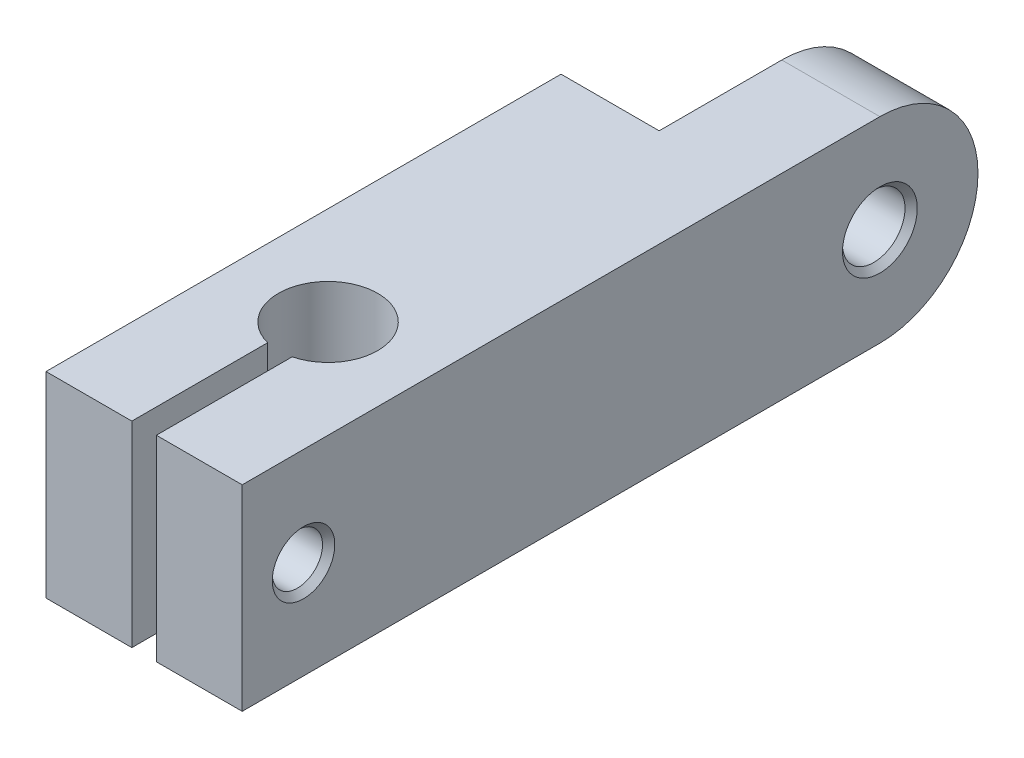
ISO-10303-21;
HEADER;
FILE_DESCRIPTION(('STEP AP214'),'2;1');
FILE_NAME('part.step','',(''),(''),'','','');
FILE_SCHEMA(('AUTOMOTIVE_DESIGN { 1 0 10303 214 1 1 1 1 }'));
ENDSEC;
DATA;
#1=APPLICATION_CONTEXT('core data for automotive mechanical design processes');
#2=APPLICATION_PROTOCOL_DEFINITION('international standard','automotive_design',2000,#1);
#3=PRODUCT_CONTEXT('',#1,'mechanical');
#4=PRODUCT('Part','Part','',(#3));
#5=PRODUCT_RELATED_PRODUCT_CATEGORY('part','',(#4));
#6=PRODUCT_DEFINITION_FORMATION('','',#4);
#7=PRODUCT_DEFINITION_CONTEXT('part definition',#1,'design');
#8=PRODUCT_DEFINITION('design','',#6,#7);
#9=PRODUCT_DEFINITION_SHAPE('','',#8);
#10=(LENGTH_UNIT() NAMED_UNIT(*) SI_UNIT(.MILLI.,.METRE.));
#11=(NAMED_UNIT(*) PLANE_ANGLE_UNIT() SI_UNIT($,.RADIAN.));
#12=(NAMED_UNIT(*) SI_UNIT($,.STERADIAN.) SOLID_ANGLE_UNIT());
#13=UNCERTAINTY_MEASURE_WITH_UNIT(LENGTH_MEASURE(1.E-05),#10,'distance_accuracy_value','');
#14=(GEOMETRIC_REPRESENTATION_CONTEXT(3) GLOBAL_UNCERTAINTY_ASSIGNED_CONTEXT((#13)) GLOBAL_UNIT_ASSIGNED_CONTEXT((#10,
#11,#12)) REPRESENTATION_CONTEXT('',''));
#15=CARTESIAN_POINT('',(0.,0.,0.));
#16=DIRECTION('',(0.,0.,1.));
#17=DIRECTION('',(1.,0.,0.));
#18=AXIS2_PLACEMENT_3D('',#15,#16,#17);
#19=CARTESIAN_POINT('',(8.,8.,60.));
#20=DIRECTION('',(0.,-1.,0.));
#21=DIRECTION('',(1.,0.,0.));
#22=AXIS2_PLACEMENT_3D('',#19,#20,#21);
#23=PLANE('',#22);
#24=DIRECTION('',(-1.,0.,0.));
#25=VECTOR('',#24,1.);
#26=CARTESIAN_POINT('',(8.,8.,8.));
#27=LINE('',#26,#25);
#28=CARTESIAN_POINT('',(8.,8.,8.));
#29=VERTEX_POINT('',#28);
#30=CARTESIAN_POINT('',(0.,8.,8.));
#31=VERTEX_POINT('',#30);
#32=EDGE_CURVE('E124',#29,#31,#27,.T.);
#33=ORIENTED_EDGE('',*,*,#32,.T.);
#34=DIRECTION('',(0.,0.,-1.));
#35=VECTOR('',#34,1.);
#36=CARTESIAN_POINT('',(0.,8.,0.));
#37=LINE('',#36,#35);
#38=CARTESIAN_POINT('',(0.,8.,18.));
#39=VERTEX_POINT('',#38);
#40=EDGE_CURVE('E267',#39,#31,#37,.T.);
#41=ORIENTED_EDGE('',*,*,#40,.F.);
#42=DIRECTION('',(1.,0.,0.));
#43=VECTOR('',#42,1.);
#44=CARTESIAN_POINT('',(-8.,8.,18.));
#45=LINE('',#44,#43);
#46=CARTESIAN_POINT('',(-8.,8.,18.));
#47=VERTEX_POINT('',#46);
#48=EDGE_CURVE('E265',#47,#39,#45,.T.);
#49=ORIENTED_EDGE('',*,*,#48,.F.);
#50=DIRECTION('',(0.,0.,-1.));
#51=VECTOR('',#50,1.);
#52=CARTESIAN_POINT('',(-8.,8.,60.));
#53=LINE('',#52,#51);
#54=CARTESIAN_POINT('',(-8.,8.,60.));
#55=VERTEX_POINT('',#54);
#56=EDGE_CURVE('E148',#55,#47,#53,.T.);
#57=ORIENTED_EDGE('',*,*,#56,.F.);
#58=DIRECTION('',(-1.,0.,0.));
#59=VECTOR('',#58,1.);
#60=CARTESIAN_POINT('',(8.,8.,60.));
#61=LINE('',#60,#59);
#62=CARTESIAN_POINT('',(-0.999999999999996,8.,60.));
#63=VERTEX_POINT('',#62);
#64=EDGE_CURVE('E62',#63,#55,#61,.T.);
#65=ORIENTED_EDGE('',*,*,#64,.F.);
#66=DIRECTION('',(0.,0.,-1.));
#67=VECTOR('',#66,1.);
#68=CARTESIAN_POINT('',(-1.00000000000001,8.,0.));
#69=LINE('',#68,#67);
#70=CARTESIAN_POINT('',(-0.999999999999996,8.,48.9246018906381));
#71=VERTEX_POINT('',#70);
#72=EDGE_CURVE('E55',#63,#71,#69,.T.);
#73=ORIENTED_EDGE('',*,*,#72,.T.);
#74=CARTESIAN_POINT('',(0.,8.,45.));
#75=DIRECTION('',(0.,1.,0.));
#76=DIRECTION('',(-1.,0.,0.));
#77=AXIS2_PLACEMENT_3D('',#74,#75,#76);
#78=CIRCLE('',#77,4.05);
#79=CARTESIAN_POINT('',(1.00000000000001,8.,48.9246018906381));
#80=VERTEX_POINT('',#79);
#81=EDGE_CURVE('E218',#80,#71,#78,.T.);
#82=ORIENTED_EDGE('',*,*,#81,.F.);
#83=DIRECTION('',(0.,0.,-1.));
#84=VECTOR('',#83,1.);
#85=CARTESIAN_POINT('',(1.00000000000001,8.,0.));
#86=LINE('',#85,#84);
#87=CARTESIAN_POINT('',(1.00000000000001,8.,60.));
#88=VERTEX_POINT('',#87);
#89=EDGE_CURVE('E232',#88,#80,#86,.T.);
#90=ORIENTED_EDGE('',*,*,#89,.F.);
#91=CARTESIAN_POINT('',(8.,8.,60.));
#92=VERTEX_POINT('',#91);
#93=EDGE_CURVE('E255',#92,#88,#61,.T.);
#94=ORIENTED_EDGE('',*,*,#93,.F.);
#95=DIRECTION('',(0.,0.,-1.));
#96=VECTOR('',#95,1.);
#97=CARTESIAN_POINT('',(8.,8.,60.));
#98=LINE('',#97,#96);
#99=EDGE_CURVE('E143',#92,#29,#98,.T.);
#100=ORIENTED_EDGE('',*,*,#99,.T.);
#101=EDGE_LOOP('',(#33,#41,#49,#57,#65,#73,#82,#90,#94,#100));
#102=FACE_BOUND('',#101,.T.);
#103=ADVANCED_FACE('F39',(#102),#23,.F.);
#104=CARTESIAN_POINT('',(0.,0.,60.));
#105=DIRECTION('',(0.,0.,1.));
#106=DIRECTION('',(1.,0.,0.));
#107=AXIS2_PLACEMENT_3D('',#104,#105,#106);
#108=PLANE('',#107);
#109=DIRECTION('',(1.,0.,0.));
#110=VECTOR('',#109,1.);
#111=CARTESIAN_POINT('',(8.,-8.,60.));
#112=LINE('',#111,#110);
#113=CARTESIAN_POINT('',(-8.,-8.,60.));
#114=VERTEX_POINT('',#113);
#115=CARTESIAN_POINT('',(-0.999999999999993,-8.,60.));
#116=VERTEX_POINT('',#115);
#117=EDGE_CURVE('E251',#114,#116,#112,.T.);
#118=ORIENTED_EDGE('',*,*,#117,.T.);
#119=DIRECTION('',(0.,1.,0.));
#120=VECTOR('',#119,1.);
#121=CARTESIAN_POINT('',(-0.999999999999993,-8.,60.));
#122=LINE('',#121,#120);
#123=EDGE_CURVE('E246',#116,#63,#122,.T.);
#124=ORIENTED_EDGE('',*,*,#123,.T.);
#125=ORIENTED_EDGE('',*,*,#64,.T.);
#126=DIRECTION('',(0.,-1.,0.));
#127=VECTOR('',#126,1.);
#128=CARTESIAN_POINT('',(-8.,-8.,60.));
#129=LINE('',#128,#127);
#130=EDGE_CURVE('E243',#55,#114,#129,.T.);
#131=ORIENTED_EDGE('',*,*,#130,.T.);
#132=EDGE_LOOP('',(#118,#124,#125,#131));
#133=FACE_BOUND('',#132,.T.);
#134=ADVANCED_FACE('F174',(#133),#108,.T.);
#135=CARTESIAN_POINT('',(-8.,-8.,60.));
#136=DIRECTION('',(1.,0.,0.));
#137=DIRECTION('',(0.,0.,-1.));
#138=AXIS2_PLACEMENT_3D('',#135,#136,#137);
#139=PLANE('',#138);
#140=CARTESIAN_POINT('',(-8.,0.,55.));
#141=DIRECTION('',(-1.,0.,0.));
#142=DIRECTION('',(0.,0.,1.));
#143=AXIS2_PLACEMENT_3D('',#140,#141,#142);
#144=CIRCLE('',#143,1.64999999999999);
#145=CARTESIAN_POINT('',(-8.,0.,56.65));
#146=VERTEX_POINT('',#145);
#147=EDGE_CURVE('E224',#146,#146,#144,.T.);
#148=ORIENTED_EDGE('',*,*,#147,.F.);
#149=EDGE_LOOP('',(#148));
#150=FACE_BOUND('',#149,.T.);
#151=ORIENTED_EDGE('',*,*,#56,.T.);
#152=DIRECTION('',(0.,-1.,0.));
#153=VECTOR('',#152,1.);
#154=CARTESIAN_POINT('',(-8.,0.,18.));
#155=LINE('',#154,#153);
#156=CARTESIAN_POINT('',(-8.,-8.,18.));
#157=VERTEX_POINT('',#156);
#158=EDGE_CURVE('E262',#47,#157,#155,.T.);
#159=ORIENTED_EDGE('',*,*,#158,.T.);
#160=DIRECTION('',(0.,0.,-1.));
#161=VECTOR('',#160,1.);
#162=CARTESIAN_POINT('',(-8.,-8.,60.));
#163=LINE('',#162,#161);
#164=EDGE_CURVE('E142',#114,#157,#163,.T.);
#165=ORIENTED_EDGE('',*,*,#164,.F.);
#166=ORIENTED_EDGE('',*,*,#130,.F.);
#167=EDGE_LOOP('',(#151,#159,#165,#166));
#168=FACE_BOUND('',#167,.T.);
#169=ADVANCED_FACE('F180',(#150,#168),#139,.F.);
#170=CARTESIAN_POINT('',(8.,-8.,60.));
#171=DIRECTION('',(0.,1.,0.));
#172=DIRECTION('',(-1.,0.,0.));
#173=AXIS2_PLACEMENT_3D('',#170,#171,#172);
#174=PLANE('',#173);
#175=DIRECTION('',(0.,0.,-1.));
#176=VECTOR('',#175,1.);
#177=CARTESIAN_POINT('',(0.,-8.,0.));
#178=LINE('',#177,#176);
#179=CARTESIAN_POINT('',(0.,-8.,18.));
#180=VERTEX_POINT('',#179);
#181=CARTESIAN_POINT('',(0.,-8.,8.));
#182=VERTEX_POINT('',#181);
#183=EDGE_CURVE('E138',#180,#182,#178,.T.);
#184=ORIENTED_EDGE('',*,*,#183,.T.);
#185=DIRECTION('',(-1.,0.,0.));
#186=VECTOR('',#185,1.);
#187=CARTESIAN_POINT('',(8.,-8.,8.));
#188=LINE('',#187,#186);
#189=CARTESIAN_POINT('',(8.,-8.,8.));
#190=VERTEX_POINT('',#189);
#191=EDGE_CURVE('E121',#190,#182,#188,.T.);
#192=ORIENTED_EDGE('',*,*,#191,.F.);
#193=DIRECTION('',(0.,0.,-1.));
#194=VECTOR('',#193,1.);
#195=CARTESIAN_POINT('',(8.,-8.,60.));
#196=LINE('',#195,#194);
#197=CARTESIAN_POINT('',(8.,-8.,60.));
#198=VERTEX_POINT('',#197);
#199=EDGE_CURVE('E135',#198,#190,#196,.T.);
#200=ORIENTED_EDGE('',*,*,#199,.F.);
#201=CARTESIAN_POINT('',(1.00000000000001,-8.,60.));
#202=VERTEX_POINT('',#201);
#203=EDGE_CURVE('E250',#202,#198,#112,.T.);
#204=ORIENTED_EDGE('',*,*,#203,.F.);
#205=DIRECTION('',(0.,0.,-1.));
#206=VECTOR('',#205,1.);
#207=CARTESIAN_POINT('',(1.00000000000001,-8.,0.));
#208=LINE('',#207,#206);
#209=CARTESIAN_POINT('',(1.00000000000001,-8.,48.9246018906381));
#210=VERTEX_POINT('',#209);
#211=EDGE_CURVE('E234',#202,#210,#208,.T.);
#212=ORIENTED_EDGE('',*,*,#211,.T.);
#213=CARTESIAN_POINT('',(0.,-8.,45.));
#214=DIRECTION('',(0.,1.,0.));
#215=DIRECTION('',(-1.,0.,0.));
#216=AXIS2_PLACEMENT_3D('',#213,#214,#215);
#217=CIRCLE('',#216,4.05);
#218=CARTESIAN_POINT('',(-0.999999999999994,-8.,48.9246018906381));
#219=VERTEX_POINT('',#218);
#220=EDGE_CURVE('E228',#210,#219,#217,.T.);
#221=ORIENTED_EDGE('',*,*,#220,.T.);
#222=DIRECTION('',(0.,0.,-1.));
#223=VECTOR('',#222,1.);
#224=CARTESIAN_POINT('',(-1.00000000000001,-8.,0.));
#225=LINE('',#224,#223);
#226=EDGE_CURVE('E231',#116,#219,#225,.T.);
#227=ORIENTED_EDGE('',*,*,#226,.F.);
#228=ORIENTED_EDGE('',*,*,#117,.F.);
#229=ORIENTED_EDGE('',*,*,#164,.T.);
#230=DIRECTION('',(1.,0.,0.));
#231=VECTOR('',#230,1.);
#232=CARTESIAN_POINT('',(-8.,-8.,18.));
#233=LINE('',#232,#231);
#234=EDGE_CURVE('E271',#157,#180,#233,.T.);
#235=ORIENTED_EDGE('',*,*,#234,.T.);
#236=EDGE_LOOP('',(#184,#192,#200,#204,#212,#221,#227,#228,#229,#235));
#237=FACE_BOUND('',#236,.T.);
#238=ADVANCED_FACE('F133',(#237),#174,.F.);
#239=CARTESIAN_POINT('',(8.,-8.,60.));
#240=DIRECTION('',(-1.,0.,0.));
#241=DIRECTION('',(0.,0.,1.));
#242=AXIS2_PLACEMENT_3D('',#239,#240,#241);
#243=PLANE('',#242);
#244=CARTESIAN_POINT('',(8.,0.,8.));
#245=DIRECTION('',(-1.,0.,0.));
#246=DIRECTION('',(0.,0.,1.));
#247=AXIS2_PLACEMENT_3D('',#244,#245,#246);
#248=CIRCLE('',#247,3.05);
#249=CARTESIAN_POINT('',(8.,0.,11.05));
#250=VERTEX_POINT('',#249);
#251=EDGE_CURVE('E11',#250,#250,#248,.T.);
#252=ORIENTED_EDGE('',*,*,#251,.T.);
#253=EDGE_LOOP('',(#252));
#254=FACE_BOUND('',#253,.T.);
#255=CARTESIAN_POINT('',(8.,0.,55.));
#256=DIRECTION('',(-1.,0.,0.));
#257=DIRECTION('',(0.,0.,1.));
#258=AXIS2_PLACEMENT_3D('',#255,#256,#257);
#259=CIRCLE('',#258,2.55000000000002);
#260=CARTESIAN_POINT('',(8.,0.,57.55));
#261=VERTEX_POINT('',#260);
#262=EDGE_CURVE('E154',#261,#261,#259,.T.);
#263=ORIENTED_EDGE('',*,*,#262,.T.);
#264=EDGE_LOOP('',(#263));
#265=FACE_BOUND('',#264,.T.);
#266=ORIENTED_EDGE('',*,*,#199,.T.);
#267=CARTESIAN_POINT('',(8.,0.,8.));
#268=DIRECTION('',(1.,0.,0.));
#269=DIRECTION('',(0.,0.,-1.));
#270=AXIS2_PLACEMENT_3D('',#267,#268,#269);
#271=CIRCLE('',#270,8.);
#272=EDGE_CURVE('E118',#190,#29,#271,.T.);
#273=ORIENTED_EDGE('',*,*,#272,.T.);
#274=ORIENTED_EDGE('',*,*,#99,.F.);
#275=DIRECTION('',(0.,1.,0.));
#276=VECTOR('',#275,1.);
#277=CARTESIAN_POINT('',(8.,-8.,60.));
#278=LINE('',#277,#276);
#279=EDGE_CURVE('E141',#198,#92,#278,.T.);
#280=ORIENTED_EDGE('',*,*,#279,.F.);
#281=EDGE_LOOP('',(#266,#273,#274,#280));
#282=FACE_BOUND('',#281,.T.);
#283=ADVANCED_FACE('F140',(#254,#265,#282),#243,.F.);
#284=DIRECTION('',(0.,1.,0.));
#285=VECTOR('',#284,1.);
#286=CARTESIAN_POINT('',(1.00000000000001,-8.,60.));
#287=LINE('',#286,#285);
#288=EDGE_CURVE('E244',#202,#88,#287,.T.);
#289=ORIENTED_EDGE('',*,*,#288,.F.);
#290=ORIENTED_EDGE('',*,*,#203,.T.);
#291=ORIENTED_EDGE('',*,*,#279,.T.);
#292=ORIENTED_EDGE('',*,*,#93,.T.);
#293=EDGE_LOOP('',(#289,#290,#291,#292));
#294=FACE_BOUND('',#293,.T.);
#295=ADVANCED_FACE('F182',(#294),#108,.T.);
#296=CARTESIAN_POINT('',(0.,-8.,45.));
#297=DIRECTION('',(0.,1.,0.));
#298=DIRECTION('',(-1.,0.,0.));
#299=AXIS2_PLACEMENT_3D('',#296,#297,#298);
#300=CYLINDRICAL_SURFACE('',#299,4.05);
#301=ORIENTED_EDGE('',*,*,#81,.T.);
#302=DIRECTION('',(0.,1.,0.));
#303=VECTOR('',#302,1.);
#304=CARTESIAN_POINT('',(-0.999999999999994,-8.,48.9246018906381));
#305=LINE('',#304,#303);
#306=EDGE_CURVE('E236',#219,#71,#305,.T.);
#307=ORIENTED_EDGE('',*,*,#306,.F.);
#308=ORIENTED_EDGE('',*,*,#220,.F.);
#309=DIRECTION('',(0.,1.,0.));
#310=VECTOR('',#309,1.);
#311=CARTESIAN_POINT('',(1.00000000000001,-8.,48.9246018906381));
#312=LINE('',#311,#310);
#313=EDGE_CURVE('E241',#210,#80,#312,.T.);
#314=ORIENTED_EDGE('',*,*,#313,.T.);
#315=EDGE_LOOP('',(#301,#307,#308,#314));
#316=FACE_BOUND('',#315,.T.);
#317=ADVANCED_FACE('F290',(#316),#300,.F.);
#318=CARTESIAN_POINT('',(1.00000000000001,-8.,0.));
#319=DIRECTION('',(1.,0.,0.));
#320=DIRECTION('',(0.,1.,0.));
#321=AXIS2_PLACEMENT_3D('',#318,#319,#320);
#322=PLANE('',#321);
#323=CARTESIAN_POINT('',(1.00000000000001,0.,55.));
#324=DIRECTION('',(1.,0.,0.));
#325=DIRECTION('',(0.,1.,0.));
#326=AXIS2_PLACEMENT_3D('',#323,#324,#325);
#327=CIRCLE('',#326,2.05);
#328=CARTESIAN_POINT('',(1.00000000000001,2.05,55.));
#329=VERTEX_POINT('',#328);
#330=EDGE_CURVE('E216',#329,#329,#327,.F.);
#331=ORIENTED_EDGE('',*,*,#330,.F.);
#332=EDGE_LOOP('',(#331));
#333=FACE_BOUND('',#332,.T.);
#334=ORIENTED_EDGE('',*,*,#89,.T.);
#335=ORIENTED_EDGE('',*,*,#313,.F.);
#336=ORIENTED_EDGE('',*,*,#211,.F.);
#337=ORIENTED_EDGE('',*,*,#288,.T.);
#338=EDGE_LOOP('',(#334,#335,#336,#337));
#339=FACE_BOUND('',#338,.T.);
#340=ADVANCED_FACE('F294',(#333,#339),#322,.F.);
#341=CARTESIAN_POINT('',(-1.00000000000001,-8.,0.));
#342=DIRECTION('',(1.,0.,0.));
#343=DIRECTION('',(0.,0.,-1.));
#344=AXIS2_PLACEMENT_3D('',#341,#342,#343);
#345=PLANE('',#344);
#346=CARTESIAN_POINT('',(-0.999999999999994,0.,55.));
#347=DIRECTION('',(1.,0.,0.));
#348=DIRECTION('',(0.,0.,-1.));
#349=AXIS2_PLACEMENT_3D('',#346,#347,#348);
#350=CIRCLE('',#349,1.64999999999999);
#351=CARTESIAN_POINT('',(-0.999999999999994,0.,53.35));
#352=VERTEX_POINT('',#351);
#353=EDGE_CURVE('E219',#352,#352,#350,.T.);
#354=ORIENTED_EDGE('',*,*,#353,.F.);
#355=EDGE_LOOP('',(#354));
#356=FACE_BOUND('',#355,.T.);
#357=ORIENTED_EDGE('',*,*,#72,.F.);
#358=ORIENTED_EDGE('',*,*,#123,.F.);
#359=ORIENTED_EDGE('',*,*,#226,.T.);
#360=ORIENTED_EDGE('',*,*,#306,.T.);
#361=EDGE_LOOP('',(#357,#358,#359,#360));
#362=FACE_BOUND('',#361,.T.);
#363=ADVANCED_FACE('F207',(#356,#362),#345,.T.);
#364=CARTESIAN_POINT('',(-8.001,0.,55.));
#365=DIRECTION('',(1.,0.,0.));
#366=DIRECTION('',(0.,0.,-1.));
#367=AXIS2_PLACEMENT_3D('',#364,#365,#366);
#368=CYLINDRICAL_SURFACE('',#367,2.05);
#369=CARTESIAN_POINT('',(7.49999999999998,0.,55.));
#370=DIRECTION('',(-1.,0.,0.));
#371=DIRECTION('',(0.,0.,1.));
#372=AXIS2_PLACEMENT_3D('',#369,#370,#371);
#373=CIRCLE('',#372,2.05);
#374=CARTESIAN_POINT('',(7.49999999999998,0.,57.05));
#375=VERTEX_POINT('',#374);
#376=EDGE_CURVE('E146',#375,#375,#373,.F.);
#377=ORIENTED_EDGE('',*,*,#376,.T.);
#378=EDGE_LOOP('',(#377));
#379=FACE_BOUND('',#378,.T.);
#380=ORIENTED_EDGE('',*,*,#330,.T.);
#381=EDGE_LOOP('',(#380));
#382=FACE_BOUND('',#381,.T.);
#383=ADVANCED_FACE('F198',(#379,#382),#368,.F.);
#384=CARTESIAN_POINT('',(7.49999999999998,0.,55.));
#385=DIRECTION('',(1.,0.,0.));
#386=DIRECTION('',(0.,0.,-1.));
#387=AXIS2_PLACEMENT_3D('',#384,#385,#386);
#388=CONICAL_SURFACE('',#387,2.05,0.785398163397447);
#389=ORIENTED_EDGE('',*,*,#262,.F.);
#390=EDGE_LOOP('',(#389));
#391=FACE_BOUND('',#390,.T.);
#392=ORIENTED_EDGE('',*,*,#376,.F.);
#393=EDGE_LOOP('',(#392));
#394=FACE_BOUND('',#393,.T.);
#395=ADVANCED_FACE('F193',(#391,#394),#388,.F.);
#396=CARTESIAN_POINT('',(-8.,0.,55.));
#397=DIRECTION('',(-1.,0.,0.));
#398=DIRECTION('',(0.,0.,1.));
#399=AXIS2_PLACEMENT_3D('',#396,#397,#398);
#400=CYLINDRICAL_SURFACE('',#399,1.64999999999999);
#401=ORIENTED_EDGE('',*,*,#353,.T.);
#402=EDGE_LOOP('',(#401));
#403=FACE_BOUND('',#402,.T.);
#404=ORIENTED_EDGE('',*,*,#147,.T.);
#405=EDGE_LOOP('',(#404));
#406=FACE_BOUND('',#405,.T.);
#407=ADVANCED_FACE('F197',(#403,#406),#400,.F.);
#408=CARTESIAN_POINT('',(0.,0.,0.));
#409=DIRECTION('',(1.,0.,0.));
#410=DIRECTION('',(0.,0.,-1.));
#411=AXIS2_PLACEMENT_3D('',#408,#409,#410);
#412=PLANE('',#411);
#413=CARTESIAN_POINT('',(0.,0.,8.));
#414=DIRECTION('',(1.,0.,0.));
#415=DIRECTION('',(0.,0.,-1.));
#416=AXIS2_PLACEMENT_3D('',#413,#414,#415);
#417=CIRCLE('',#416,2.55);
#418=CARTESIAN_POINT('',(0.,0.,5.45));
#419=VERTEX_POINT('',#418);
#420=EDGE_CURVE('E129',#419,#419,#417,.T.);
#421=ORIENTED_EDGE('',*,*,#420,.T.);
#422=EDGE_LOOP('',(#421));
#423=FACE_BOUND('',#422,.T.);
#424=CARTESIAN_POINT('',(0.,0.,8.));
#425=DIRECTION('',(1.,0.,0.));
#426=DIRECTION('',(0.,0.,-1.));
#427=AXIS2_PLACEMENT_3D('',#424,#425,#426);
#428=CIRCLE('',#427,8.);
#429=EDGE_CURVE('E157',#31,#182,#428,.F.);
#430=ORIENTED_EDGE('',*,*,#429,.T.);
#431=ORIENTED_EDGE('',*,*,#183,.F.);
#432=DIRECTION('',(0.,-1.,0.));
#433=VECTOR('',#432,1.);
#434=CARTESIAN_POINT('',(0.,0.,18.));
#435=LINE('',#434,#433);
#436=EDGE_CURVE('E274',#39,#180,#435,.T.);
#437=ORIENTED_EDGE('',*,*,#436,.F.);
#438=ORIENTED_EDGE('',*,*,#40,.T.);
#439=EDGE_LOOP('',(#430,#431,#437,#438));
#440=FACE_BOUND('',#439,.T.);
#441=ADVANCED_FACE('F204',(#423,#440),#412,.F.);
#442=CARTESIAN_POINT('',(-8.,0.,18.));
#443=DIRECTION('',(0.,0.,1.));
#444=DIRECTION('',(0.,-1.,0.));
#445=AXIS2_PLACEMENT_3D('',#442,#443,#444);
#446=PLANE('',#445);
#447=ORIENTED_EDGE('',*,*,#436,.T.);
#448=ORIENTED_EDGE('',*,*,#234,.F.);
#449=ORIENTED_EDGE('',*,*,#158,.F.);
#450=ORIENTED_EDGE('',*,*,#48,.T.);
#451=EDGE_LOOP('',(#447,#448,#449,#450));
#452=FACE_BOUND('',#451,.T.);
#453=ADVANCED_FACE('F285',(#452),#446,.F.);
#454=CARTESIAN_POINT('',(8.,0.,8.));
#455=DIRECTION('',(-1.,0.,0.));
#456=DIRECTION('',(0.,0.,1.));
#457=AXIS2_PLACEMENT_3D('',#454,#455,#456);
#458=CYLINDRICAL_SURFACE('',#457,8.);
#459=ORIENTED_EDGE('',*,*,#429,.F.);
#460=ORIENTED_EDGE('',*,*,#32,.F.);
#461=ORIENTED_EDGE('',*,*,#272,.F.);
#462=ORIENTED_EDGE('',*,*,#191,.T.);
#463=EDGE_LOOP('',(#459,#460,#461,#462));
#464=FACE_BOUND('',#463,.T.);
#465=ADVANCED_FACE('F120',(#464),#458,.T.);
#466=CARTESIAN_POINT('',(-8.,0.,8.));
#467=DIRECTION('',(1.,0.,0.));
#468=DIRECTION('',(0.,0.,-1.));
#469=AXIS2_PLACEMENT_3D('',#466,#467,#468);
#470=CYLINDRICAL_SURFACE('',#469,2.55);
#471=CARTESIAN_POINT('',(7.5,0.,8.));
#472=DIRECTION('',(-1.,0.,0.));
#473=DIRECTION('',(0.,0.,1.));
#474=AXIS2_PLACEMENT_3D('',#471,#472,#473);
#475=CIRCLE('',#474,2.55);
#476=CARTESIAN_POINT('',(7.5,0.,10.55));
#477=VERTEX_POINT('',#476);
#478=EDGE_CURVE('E48',#477,#477,#475,.F.);
#479=ORIENTED_EDGE('',*,*,#478,.T.);
#480=EDGE_LOOP('',(#479));
#481=FACE_BOUND('',#480,.T.);
#482=ORIENTED_EDGE('',*,*,#420,.F.);
#483=EDGE_LOOP('',(#482));
#484=FACE_BOUND('',#483,.T.);
#485=ADVANCED_FACE('F163',(#481,#484),#470,.F.);
#486=CARTESIAN_POINT('',(7.5,0.,8.));
#487=DIRECTION('',(1.,0.,0.));
#488=DIRECTION('',(0.,0.,-1.));
#489=AXIS2_PLACEMENT_3D('',#486,#487,#488);
#490=CONICAL_SURFACE('',#489,2.55,0.785398163397446);
#491=ORIENTED_EDGE('',*,*,#251,.F.);
#492=EDGE_LOOP('',(#491));
#493=FACE_BOUND('',#492,.T.);
#494=ORIENTED_EDGE('',*,*,#478,.F.);
#495=EDGE_LOOP('',(#494));
#496=FACE_BOUND('',#495,.T.);
#497=ADVANCED_FACE('F42',(#493,#496),#490,.F.);
#498=CLOSED_SHELL('',(#103,#134,#169,#238,#283,#295,#317,#340,#363,#383,#395,#407,#441,#453,
#465,#485,#497));
#499=MANIFOLD_SOLID_BREP('B2',#498);
#500=ADVANCED_BREP_SHAPE_REPRESENTATION('',(#18,#499),#14);
#501=SHAPE_DEFINITION_REPRESENTATION(#9,#500);
ENDSEC;
END-ISO-10303-21;
